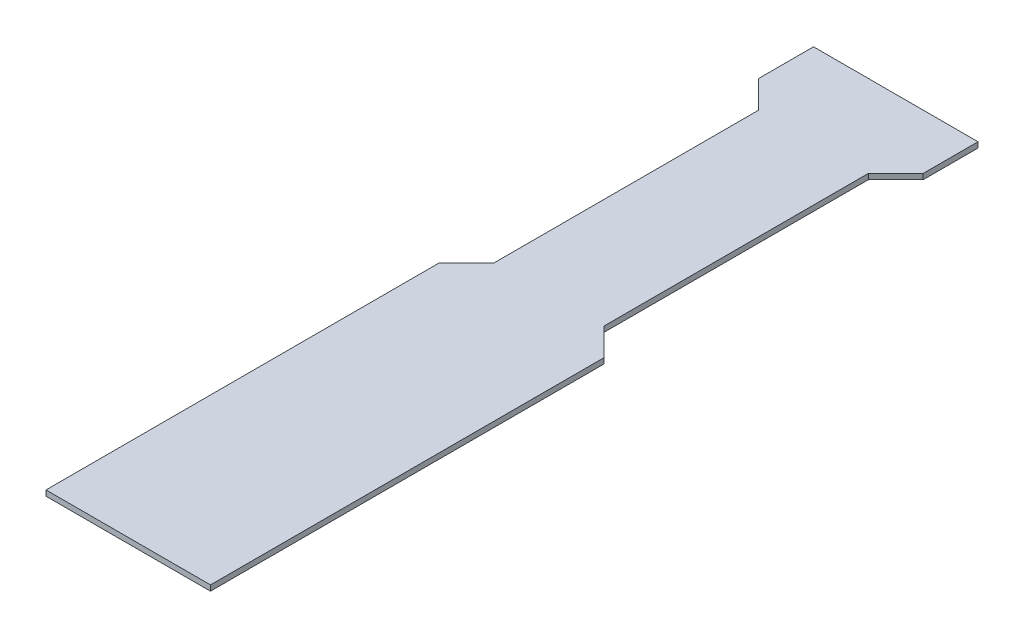
ISO-10303-21;
HEADER;
FILE_DESCRIPTION(('STEP AP214'),'2;1');
FILE_NAME('part.step','',(''),(''),'','','');
FILE_SCHEMA(('AUTOMOTIVE_DESIGN { 1 0 10303 214 1 1 1 1 }'));
ENDSEC;
DATA;
#1=APPLICATION_CONTEXT('core data for automotive mechanical design processes');
#2=APPLICATION_PROTOCOL_DEFINITION('international standard','automotive_design',2000,#1);
#3=PRODUCT_CONTEXT('',#1,'mechanical');
#4=PRODUCT('Part','Part','',(#3));
#5=PRODUCT_RELATED_PRODUCT_CATEGORY('part','',(#4));
#6=PRODUCT_DEFINITION_FORMATION('','',#4);
#7=PRODUCT_DEFINITION_CONTEXT('part definition',#1,'design');
#8=PRODUCT_DEFINITION('design','',#6,#7);
#9=PRODUCT_DEFINITION_SHAPE('','',#8);
#10=(LENGTH_UNIT() NAMED_UNIT(*) SI_UNIT(.MILLI.,.METRE.));
#11=(NAMED_UNIT(*) PLANE_ANGLE_UNIT() SI_UNIT($,.RADIAN.));
#12=(NAMED_UNIT(*) SI_UNIT($,.STERADIAN.) SOLID_ANGLE_UNIT());
#13=UNCERTAINTY_MEASURE_WITH_UNIT(LENGTH_MEASURE(1.E-05),#10,'distance_accuracy_value','');
#14=(GEOMETRIC_REPRESENTATION_CONTEXT(3) GLOBAL_UNCERTAINTY_ASSIGNED_CONTEXT((#13)) GLOBAL_UNIT_ASSIGNED_CONTEXT((#10,
#11,#12)) REPRESENTATION_CONTEXT('',''));
#15=CARTESIAN_POINT('',(0.,0.,0.));
#16=DIRECTION('',(0.,0.,1.));
#17=DIRECTION('',(1.,0.,0.));
#18=AXIS2_PLACEMENT_3D('',#15,#16,#17);
#19=CARTESIAN_POINT('',(30.,2.,0.));
#20=DIRECTION('',(0.,0.,-1.));
#21=DIRECTION('',(-1.,0.,0.));
#22=AXIS2_PLACEMENT_3D('',#19,#20,#21);
#23=PLANE('',#22);
#24=DIRECTION('',(1.,0.,0.));
#25=VECTOR('',#24,1.);
#26=CARTESIAN_POINT('',(30.,0.,0.));
#27=LINE('',#26,#25);
#28=CARTESIAN_POINT('',(-30.,0.,0.));
#29=VERTEX_POINT('',#28);
#30=CARTESIAN_POINT('',(30.,0.,0.));
#31=VERTEX_POINT('',#30);
#32=EDGE_CURVE('E104',#29,#31,#27,.T.);
#33=ORIENTED_EDGE('',*,*,#32,.T.);
#34=DIRECTION('',(0.,-1.,0.));
#35=VECTOR('',#34,1.);
#36=CARTESIAN_POINT('',(30.,2.,0.));
#37=LINE('',#36,#35);
#38=CARTESIAN_POINT('',(30.,2.,0.));
#39=VERTEX_POINT('',#38);
#40=EDGE_CURVE('E11',#39,#31,#37,.T.);
#41=ORIENTED_EDGE('',*,*,#40,.F.);
#42=DIRECTION('',(1.,0.,0.));
#43=VECTOR('',#42,1.);
#44=CARTESIAN_POINT('',(0.,2.,0.));
#45=LINE('',#44,#43);
#46=CARTESIAN_POINT('',(-30.,2.,0.));
#47=VERTEX_POINT('',#46);
#48=EDGE_CURVE('E110',#47,#39,#45,.T.);
#49=ORIENTED_EDGE('',*,*,#48,.F.);
#50=DIRECTION('',(0.,-1.,0.));
#51=VECTOR('',#50,1.);
#52=CARTESIAN_POINT('',(-30.,2.,0.));
#53=LINE('',#52,#51);
#54=EDGE_CURVE('E159',#47,#29,#53,.T.);
#55=ORIENTED_EDGE('',*,*,#54,.T.);
#56=EDGE_LOOP('',(#33,#41,#49,#55));
#57=FACE_BOUND('',#56,.T.);
#58=ADVANCED_FACE('F39',(#57),#23,.F.);
#59=CARTESIAN_POINT('',(30.,2.,-143.5));
#60=DIRECTION('',(-1.,0.,0.));
#61=DIRECTION('',(0.,0.,1.));
#62=AXIS2_PLACEMENT_3D('',#59,#60,#61);
#63=PLANE('',#62);
#64=DIRECTION('',(0.,0.,-1.));
#65=VECTOR('',#64,1.);
#66=CARTESIAN_POINT('',(30.,0.,-143.5));
#67=LINE('',#66,#65);
#68=CARTESIAN_POINT('',(30.,0.,-143.5));
#69=VERTEX_POINT('',#68);
#70=EDGE_CURVE('E165',#31,#69,#67,.T.);
#71=ORIENTED_EDGE('',*,*,#70,.T.);
#72=DIRECTION('',(0.,-1.,0.));
#73=VECTOR('',#72,1.);
#74=CARTESIAN_POINT('',(30.,2.,-143.5));
#75=LINE('',#74,#73);
#76=CARTESIAN_POINT('',(30.,2.,-143.5));
#77=VERTEX_POINT('',#76);
#78=EDGE_CURVE('E48',#77,#69,#75,.T.);
#79=ORIENTED_EDGE('',*,*,#78,.F.);
#80=DIRECTION('',(0.,0.,-1.));
#81=VECTOR('',#80,1.);
#82=CARTESIAN_POINT('',(30.,2.,-143.5));
#83=LINE('',#82,#81);
#84=EDGE_CURVE('E283',#39,#77,#83,.T.);
#85=ORIENTED_EDGE('',*,*,#84,.F.);
#86=ORIENTED_EDGE('',*,*,#40,.T.);
#87=EDGE_LOOP('',(#71,#79,#85,#86));
#88=FACE_BOUND('',#87,.T.);
#89=ADVANCED_FACE('F288',(#88),#63,.F.);
#90=CARTESIAN_POINT('',(30.,2.,-143.5));
#91=DIRECTION('',(-0.707106781186539,0.,0.707106781186556));
#92=DIRECTION('',(0.707106781186556,0.,0.707106781186539));
#93=AXIS2_PLACEMENT_3D('',#90,#91,#92);
#94=PLANE('',#93);
#95=DIRECTION('',(-0.707106781186556,0.,-0.707106781186539));
#96=VECTOR('',#95,1.);
#97=CARTESIAN_POINT('',(30.,0.,-143.5));
#98=LINE('',#97,#96);
#99=CARTESIAN_POINT('',(20.,0.,-153.5));
#100=VERTEX_POINT('',#99);
#101=EDGE_CURVE('E168',#69,#100,#98,.T.);
#102=ORIENTED_EDGE('',*,*,#101,.T.);
#103=DIRECTION('',(0.,-1.,0.));
#104=VECTOR('',#103,1.);
#105=CARTESIAN_POINT('',(20.,2.,-153.5));
#106=LINE('',#105,#104);
#107=CARTESIAN_POINT('',(20.,2.,-153.5));
#108=VERTEX_POINT('',#107);
#109=EDGE_CURVE('E225',#108,#100,#106,.T.);
#110=ORIENTED_EDGE('',*,*,#109,.F.);
#111=DIRECTION('',(-0.707106781186556,0.,-0.707106781186539));
#112=VECTOR('',#111,1.);
#113=CARTESIAN_POINT('',(30.,2.,-143.5));
#114=LINE('',#113,#112);
#115=EDGE_CURVE('E236',#77,#108,#114,.T.);
#116=ORIENTED_EDGE('',*,*,#115,.F.);
#117=ORIENTED_EDGE('',*,*,#78,.T.);
#118=EDGE_LOOP('',(#102,#110,#116,#117));
#119=FACE_BOUND('',#118,.T.);
#120=ADVANCED_FACE('F234',(#119),#94,.F.);
#121=CARTESIAN_POINT('',(20.,2.,-250.));
#122=DIRECTION('',(-1.,0.,0.));
#123=DIRECTION('',(0.,0.,1.));
#124=AXIS2_PLACEMENT_3D('',#121,#122,#123);
#125=PLANE('',#124);
#126=DIRECTION('',(0.,0.,-1.));
#127=VECTOR('',#126,1.);
#128=CARTESIAN_POINT('',(20.,0.,-250.));
#129=LINE('',#128,#127);
#130=CARTESIAN_POINT('',(20.,0.,-250.));
#131=VERTEX_POINT('',#130);
#132=EDGE_CURVE('E172',#100,#131,#129,.T.);
#133=ORIENTED_EDGE('',*,*,#132,.T.);
#134=DIRECTION('',(0.,-1.,0.));
#135=VECTOR('',#134,1.);
#136=CARTESIAN_POINT('',(20.,2.,-250.));
#137=LINE('',#136,#135);
#138=CARTESIAN_POINT('',(20.,2.,-250.));
#139=VERTEX_POINT('',#138);
#140=EDGE_CURVE('E221',#139,#131,#137,.T.);
#141=ORIENTED_EDGE('',*,*,#140,.F.);
#142=DIRECTION('',(0.,0.,-1.));
#143=VECTOR('',#142,1.);
#144=CARTESIAN_POINT('',(20.,2.,-240.));
#145=LINE('',#144,#143);
#146=EDGE_CURVE('E254',#108,#139,#145,.T.);
#147=ORIENTED_EDGE('',*,*,#146,.F.);
#148=ORIENTED_EDGE('',*,*,#109,.T.);
#149=EDGE_LOOP('',(#133,#141,#147,#148));
#150=FACE_BOUND('',#149,.T.);
#151=ADVANCED_FACE('F244',(#150),#125,.F.);
#152=CARTESIAN_POINT('',(30.0000000000001,2.,-260.));
#153=DIRECTION('',(-0.707106781186549,0.,-0.707106781186546));
#154=DIRECTION('',(-0.707106781186546,0.,0.707106781186549));
#155=AXIS2_PLACEMENT_3D('',#152,#153,#154);
#156=PLANE('',#155);
#157=DIRECTION('',(0.707106781186546,0.,-0.707106781186549));
#158=VECTOR('',#157,1.);
#159=CARTESIAN_POINT('',(30.0000000000001,0.,-260.));
#160=LINE('',#159,#158);
#161=CARTESIAN_POINT('',(30.0000000000001,0.,-260.));
#162=VERTEX_POINT('',#161);
#163=EDGE_CURVE('E175',#131,#162,#160,.T.);
#164=ORIENTED_EDGE('',*,*,#163,.T.);
#165=DIRECTION('',(0.,-1.,0.));
#166=VECTOR('',#165,1.);
#167=CARTESIAN_POINT('',(30.0000000000001,2.,-260.));
#168=LINE('',#167,#166);
#169=CARTESIAN_POINT('',(30.0000000000001,2.,-260.));
#170=VERTEX_POINT('',#169);
#171=EDGE_CURVE('E217',#170,#162,#168,.T.);
#172=ORIENTED_EDGE('',*,*,#171,.F.);
#173=DIRECTION('',(0.707106781186546,0.,-0.707106781186549));
#174=VECTOR('',#173,1.);
#175=CARTESIAN_POINT('',(30.0000000000001,2.,-260.));
#176=LINE('',#175,#174);
#177=EDGE_CURVE('E250',#139,#170,#176,.T.);
#178=ORIENTED_EDGE('',*,*,#177,.F.);
#179=ORIENTED_EDGE('',*,*,#140,.T.);
#180=EDGE_LOOP('',(#164,#172,#178,#179));
#181=FACE_BOUND('',#180,.T.);
#182=ADVANCED_FACE('F248',(#181),#156,.F.);
#183=CARTESIAN_POINT('',(30.0000000000001,2.,-260.));
#184=DIRECTION('',(-1.,0.,0.));
#185=DIRECTION('',(0.,0.,1.));
#186=AXIS2_PLACEMENT_3D('',#183,#184,#185);
#187=PLANE('',#186);
#188=DIRECTION('',(0.,0.,-1.));
#189=VECTOR('',#188,1.);
#190=CARTESIAN_POINT('',(30.0000000000001,0.,-260.));
#191=LINE('',#190,#189);
#192=CARTESIAN_POINT('',(30.0000000000001,0.,-280.));
#193=VERTEX_POINT('',#192);
#194=EDGE_CURVE('E178',#162,#193,#191,.T.);
#195=ORIENTED_EDGE('',*,*,#194,.T.);
#196=DIRECTION('',(0.,-1.,0.));
#197=VECTOR('',#196,1.);
#198=CARTESIAN_POINT('',(30.0000000000001,2.,-280.));
#199=LINE('',#198,#197);
#200=CARTESIAN_POINT('',(30.0000000000001,2.,-280.));
#201=VERTEX_POINT('',#200);
#202=EDGE_CURVE('E213',#201,#193,#199,.T.);
#203=ORIENTED_EDGE('',*,*,#202,.F.);
#204=DIRECTION('',(0.,0.,-1.));
#205=VECTOR('',#204,1.);
#206=CARTESIAN_POINT('',(30.0000000000001,2.,-260.));
#207=LINE('',#206,#205);
#208=EDGE_CURVE('E253',#170,#201,#207,.T.);
#209=ORIENTED_EDGE('',*,*,#208,.F.);
#210=ORIENTED_EDGE('',*,*,#171,.T.);
#211=EDGE_LOOP('',(#195,#203,#209,#210));
#212=FACE_BOUND('',#211,.T.);
#213=ADVANCED_FACE('F300',(#212),#187,.F.);
#214=CARTESIAN_POINT('',(-30.0000000000001,2.,-280.));
#215=DIRECTION('',(0.,0.,1.));
#216=DIRECTION('',(1.,0.,0.));
#217=AXIS2_PLACEMENT_3D('',#214,#215,#216);
#218=PLANE('',#217);
#219=DIRECTION('',(-1.,0.,0.));
#220=VECTOR('',#219,1.);
#221=CARTESIAN_POINT('',(-30.0000000000001,0.,-280.));
#222=LINE('',#221,#220);
#223=CARTESIAN_POINT('',(-30.0000000000001,0.,-280.));
#224=VERTEX_POINT('',#223);
#225=EDGE_CURVE('E181',#193,#224,#222,.T.);
#226=ORIENTED_EDGE('',*,*,#225,.T.);
#227=DIRECTION('',(0.,-1.,0.));
#228=VECTOR('',#227,1.);
#229=CARTESIAN_POINT('',(-30.0000000000001,2.,-280.));
#230=LINE('',#229,#228);
#231=CARTESIAN_POINT('',(-30.0000000000001,2.,-280.));
#232=VERTEX_POINT('',#231);
#233=EDGE_CURVE('E209',#232,#224,#230,.T.);
#234=ORIENTED_EDGE('',*,*,#233,.F.);
#235=DIRECTION('',(-1.,0.,0.));
#236=VECTOR('',#235,1.);
#237=CARTESIAN_POINT('',(-30.0000000000001,2.,-280.));
#238=LINE('',#237,#236);
#239=EDGE_CURVE('E258',#201,#232,#238,.T.);
#240=ORIENTED_EDGE('',*,*,#239,.F.);
#241=ORIENTED_EDGE('',*,*,#202,.T.);
#242=EDGE_LOOP('',(#226,#234,#240,#241));
#243=FACE_BOUND('',#242,.T.);
#244=ADVANCED_FACE('F303',(#243),#218,.F.);
#245=CARTESIAN_POINT('',(-30.0000000000001,2.,-260.));
#246=DIRECTION('',(1.,0.,0.));
#247=DIRECTION('',(0.,0.,-1.));
#248=AXIS2_PLACEMENT_3D('',#245,#246,#247);
#249=PLANE('',#248);
#250=DIRECTION('',(0.,0.,1.));
#251=VECTOR('',#250,1.);
#252=CARTESIAN_POINT('',(-30.0000000000001,0.,-260.));
#253=LINE('',#252,#251);
#254=CARTESIAN_POINT('',(-30.0000000000001,0.,-260.));
#255=VERTEX_POINT('',#254);
#256=EDGE_CURVE('E184',#224,#255,#253,.T.);
#257=ORIENTED_EDGE('',*,*,#256,.T.);
#258=DIRECTION('',(0.,-1.,0.));
#259=VECTOR('',#258,1.);
#260=CARTESIAN_POINT('',(-30.0000000000001,2.,-260.));
#261=LINE('',#260,#259);
#262=CARTESIAN_POINT('',(-30.0000000000001,2.,-260.));
#263=VERTEX_POINT('',#262);
#264=EDGE_CURVE('E205',#263,#255,#261,.T.);
#265=ORIENTED_EDGE('',*,*,#264,.F.);
#266=DIRECTION('',(0.,0.,1.));
#267=VECTOR('',#266,1.);
#268=CARTESIAN_POINT('',(-30.0000000000001,2.,-260.));
#269=LINE('',#268,#267);
#270=EDGE_CURVE('E265',#232,#263,#269,.T.);
#271=ORIENTED_EDGE('',*,*,#270,.F.);
#272=ORIENTED_EDGE('',*,*,#233,.T.);
#273=EDGE_LOOP('',(#257,#265,#271,#272));
#274=FACE_BOUND('',#273,.T.);
#275=ADVANCED_FACE('F273',(#274),#249,.F.);
#276=CARTESIAN_POINT('',(-30.0000000000001,2.,-260.));
#277=DIRECTION('',(0.707106781186549,0.,-0.707106781186546));
#278=DIRECTION('',(-0.707106781186546,0.,-0.707106781186549));
#279=AXIS2_PLACEMENT_3D('',#276,#277,#278);
#280=PLANE('',#279);
#281=DIRECTION('',(0.707106781186546,0.,0.707106781186549));
#282=VECTOR('',#281,1.);
#283=CARTESIAN_POINT('',(-30.0000000000001,0.,-260.));
#284=LINE('',#283,#282);
#285=CARTESIAN_POINT('',(-20.,0.,-250.));
#286=VERTEX_POINT('',#285);
#287=EDGE_CURVE('E187',#255,#286,#284,.T.);
#288=ORIENTED_EDGE('',*,*,#287,.T.);
#289=DIRECTION('',(0.,-1.,0.));
#290=VECTOR('',#289,1.);
#291=CARTESIAN_POINT('',(-20.,2.,-250.));
#292=LINE('',#291,#290);
#293=CARTESIAN_POINT('',(-20.,2.,-250.));
#294=VERTEX_POINT('',#293);
#295=EDGE_CURVE('E152',#294,#286,#292,.T.);
#296=ORIENTED_EDGE('',*,*,#295,.F.);
#297=DIRECTION('',(0.707106781186546,0.,0.707106781186549));
#298=VECTOR('',#297,1.);
#299=CARTESIAN_POINT('',(-30.0000000000001,2.,-260.));
#300=LINE('',#299,#298);
#301=EDGE_CURVE('E142',#263,#294,#300,.T.);
#302=ORIENTED_EDGE('',*,*,#301,.F.);
#303=ORIENTED_EDGE('',*,*,#264,.T.);
#304=EDGE_LOOP('',(#288,#296,#302,#303));
#305=FACE_BOUND('',#304,.T.);
#306=ADVANCED_FACE('F277',(#305),#280,.F.);
#307=CARTESIAN_POINT('',(-20.,2.,-240.));
#308=DIRECTION('',(1.,0.,0.));
#309=DIRECTION('',(0.,0.,-1.));
#310=AXIS2_PLACEMENT_3D('',#307,#308,#309);
#311=PLANE('',#310);
#312=DIRECTION('',(0.,0.,1.));
#313=VECTOR('',#312,1.);
#314=CARTESIAN_POINT('',(-20.,0.,-240.));
#315=LINE('',#314,#313);
#316=CARTESIAN_POINT('',(-20.,0.,-153.5));
#317=VERTEX_POINT('',#316);
#318=EDGE_CURVE('E150',#286,#317,#315,.T.);
#319=ORIENTED_EDGE('',*,*,#318,.T.);
#320=DIRECTION('',(0.,-1.,0.));
#321=VECTOR('',#320,1.);
#322=CARTESIAN_POINT('',(-20.,2.,-153.5));
#323=LINE('',#322,#321);
#324=CARTESIAN_POINT('',(-20.,2.,-153.5));
#325=VERTEX_POINT('',#324);
#326=EDGE_CURVE('E148',#325,#317,#323,.T.);
#327=ORIENTED_EDGE('',*,*,#326,.F.);
#328=DIRECTION('',(0.,0.,1.));
#329=VECTOR('',#328,1.);
#330=CARTESIAN_POINT('',(-20.,2.,-250.));
#331=LINE('',#330,#329);
#332=EDGE_CURVE('E136',#294,#325,#331,.T.);
#333=ORIENTED_EDGE('',*,*,#332,.F.);
#334=ORIENTED_EDGE('',*,*,#295,.T.);
#335=EDGE_LOOP('',(#319,#327,#333,#334));
#336=FACE_BOUND('',#335,.T.);
#337=ADVANCED_FACE('F149',(#336),#311,.F.);
#338=CARTESIAN_POINT('',(-30.,2.,-143.5));
#339=DIRECTION('',(0.707106781186539,0.,0.707106781186556));
#340=DIRECTION('',(0.707106781186556,0.,-0.707106781186539));
#341=AXIS2_PLACEMENT_3D('',#338,#339,#340);
#342=PLANE('',#341);
#343=DIRECTION('',(-0.707106781186556,0.,0.707106781186539));
#344=VECTOR('',#343,1.);
#345=CARTESIAN_POINT('',(-30.,0.,-143.5));
#346=LINE('',#345,#344);
#347=CARTESIAN_POINT('',(-30.,0.,-143.5));
#348=VERTEX_POINT('',#347);
#349=EDGE_CURVE('E97',#317,#348,#346,.T.);
#350=ORIENTED_EDGE('',*,*,#349,.T.);
#351=DIRECTION('',(0.,-1.,0.));
#352=VECTOR('',#351,1.);
#353=CARTESIAN_POINT('',(-30.,2.,-143.5));
#354=LINE('',#353,#352);
#355=CARTESIAN_POINT('',(-30.,2.,-143.5));
#356=VERTEX_POINT('',#355);
#357=EDGE_CURVE('E153',#356,#348,#354,.T.);
#358=ORIENTED_EDGE('',*,*,#357,.F.);
#359=DIRECTION('',(-0.707106781186556,0.,0.707106781186539));
#360=VECTOR('',#359,1.);
#361=CARTESIAN_POINT('',(-30.,2.,-143.5));
#362=LINE('',#361,#360);
#363=EDGE_CURVE('E140',#325,#356,#362,.T.);
#364=ORIENTED_EDGE('',*,*,#363,.F.);
#365=ORIENTED_EDGE('',*,*,#326,.T.);
#366=EDGE_LOOP('',(#350,#358,#364,#365));
#367=FACE_BOUND('',#366,.T.);
#368=ADVANCED_FACE('F155',(#367),#342,.F.);
#369=CARTESIAN_POINT('',(-30.,2.,0.));
#370=DIRECTION('',(1.,0.,0.));
#371=DIRECTION('',(0.,0.,-1.));
#372=AXIS2_PLACEMENT_3D('',#369,#370,#371);
#373=PLANE('',#372);
#374=DIRECTION('',(0.,0.,1.));
#375=VECTOR('',#374,1.);
#376=CARTESIAN_POINT('',(-30.,0.,0.));
#377=LINE('',#376,#375);
#378=EDGE_CURVE('E195',#348,#29,#377,.T.);
#379=ORIENTED_EDGE('',*,*,#378,.T.);
#380=ORIENTED_EDGE('',*,*,#54,.F.);
#381=DIRECTION('',(0.,0.,1.));
#382=VECTOR('',#381,1.);
#383=CARTESIAN_POINT('',(-30.,2.,0.));
#384=LINE('',#383,#382);
#385=EDGE_CURVE('E56',#356,#47,#384,.T.);
#386=ORIENTED_EDGE('',*,*,#385,.F.);
#387=ORIENTED_EDGE('',*,*,#357,.T.);
#388=EDGE_LOOP('',(#379,#380,#386,#387));
#389=FACE_BOUND('',#388,.T.);
#390=ADVANCED_FACE('F280',(#389),#373,.F.);
#391=CARTESIAN_POINT('',(0.,2.,0.));
#392=DIRECTION('',(0.,-1.,0.));
#393=DIRECTION('',(0.,0.,-1.));
#394=AXIS2_PLACEMENT_3D('',#391,#392,#393);
#395=PLANE('',#394);
#396=ORIENTED_EDGE('',*,*,#48,.T.);
#397=ORIENTED_EDGE('',*,*,#84,.T.);
#398=ORIENTED_EDGE('',*,*,#115,.T.);
#399=ORIENTED_EDGE('',*,*,#146,.T.);
#400=ORIENTED_EDGE('',*,*,#177,.T.);
#401=ORIENTED_EDGE('',*,*,#208,.T.);
#402=ORIENTED_EDGE('',*,*,#239,.T.);
#403=ORIENTED_EDGE('',*,*,#270,.T.);
#404=ORIENTED_EDGE('',*,*,#301,.T.);
#405=ORIENTED_EDGE('',*,*,#332,.T.);
#406=ORIENTED_EDGE('',*,*,#363,.T.);
#407=ORIENTED_EDGE('',*,*,#385,.T.);
#408=EDGE_LOOP('',(#396,#397,#398,#399,#400,#401,#402,#403,#404,#405,#406,#407));
#409=FACE_BOUND('',#408,.T.);
#410=ADVANCED_FACE('F138',(#409),#395,.F.);
#411=CARTESIAN_POINT('',(0.,0.,0.));
#412=DIRECTION('',(0.,-1.,0.));
#413=DIRECTION('',(0.,0.,-1.));
#414=AXIS2_PLACEMENT_3D('',#411,#412,#413);
#415=PLANE('',#414);
#416=ORIENTED_EDGE('',*,*,#32,.F.);
#417=ORIENTED_EDGE('',*,*,#378,.F.);
#418=ORIENTED_EDGE('',*,*,#349,.F.);
#419=ORIENTED_EDGE('',*,*,#318,.F.);
#420=ORIENTED_EDGE('',*,*,#287,.F.);
#421=ORIENTED_EDGE('',*,*,#256,.F.);
#422=ORIENTED_EDGE('',*,*,#225,.F.);
#423=ORIENTED_EDGE('',*,*,#194,.F.);
#424=ORIENTED_EDGE('',*,*,#163,.F.);
#425=ORIENTED_EDGE('',*,*,#132,.F.);
#426=ORIENTED_EDGE('',*,*,#101,.F.);
#427=ORIENTED_EDGE('',*,*,#70,.F.);
#428=EDGE_LOOP('',(#416,#417,#418,#419,#420,#421,#422,#423,#424,#425,#426,#427));
#429=FACE_BOUND('',#428,.T.);
#430=ADVANCED_FACE('F239',(#429),#415,.T.);
#431=CLOSED_SHELL('',(#58,#89,#120,#151,#182,#213,#244,#275,#306,#337,#368,#390,#410,#430));
#432=MANIFOLD_SOLID_BREP('B2',#431);
#433=ADVANCED_BREP_SHAPE_REPRESENTATION('',(#18,#432),#14);
#434=SHAPE_DEFINITION_REPRESENTATION(#9,#433);
ENDSEC;
END-ISO-10303-21;
